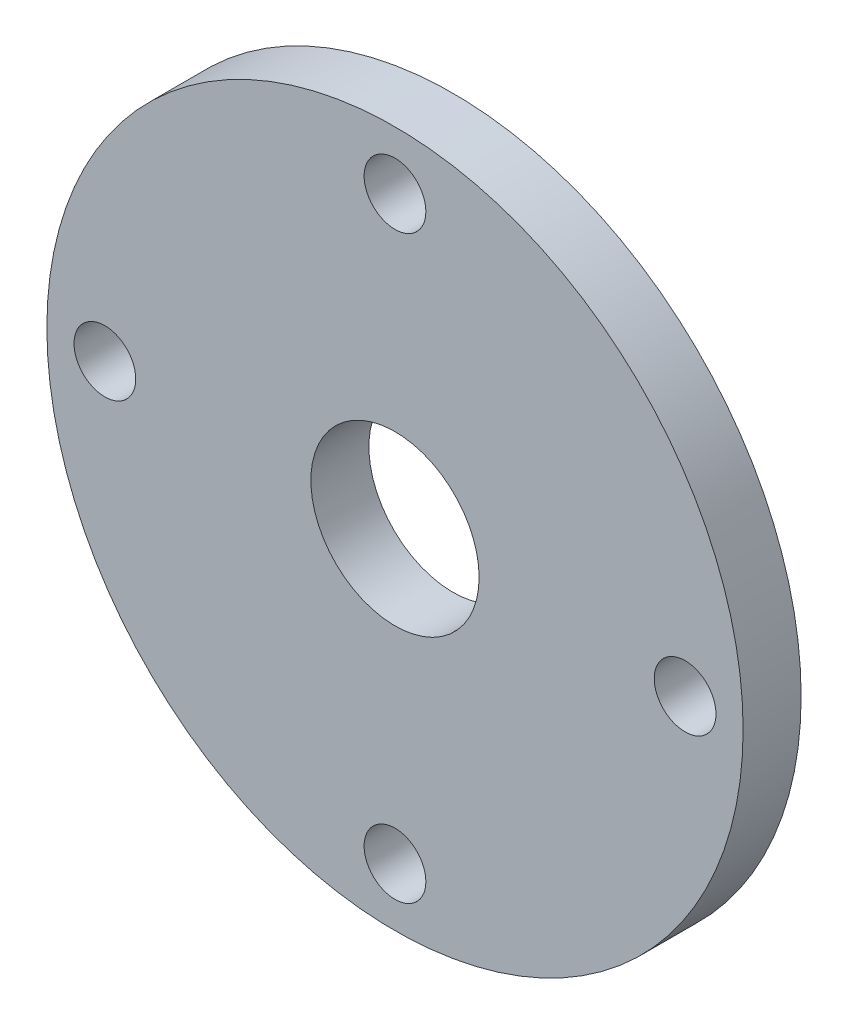
ISO-10303-21;
HEADER;
FILE_DESCRIPTION(('STEP AP214'),'2;1');
FILE_NAME('part.step','',(''),(''),'','','');
FILE_SCHEMA(('AUTOMOTIVE_DESIGN { 1 0 10303 214 1 1 1 1 }'));
ENDSEC;
DATA;
#1=APPLICATION_CONTEXT('core data for automotive mechanical design processes');
#2=APPLICATION_PROTOCOL_DEFINITION('international standard','automotive_design',2000,#1);
#3=PRODUCT_CONTEXT('',#1,'mechanical');
#4=PRODUCT('Part','Part','',(#3));
#5=PRODUCT_RELATED_PRODUCT_CATEGORY('part','',(#4));
#6=PRODUCT_DEFINITION_FORMATION('','',#4);
#7=PRODUCT_DEFINITION_CONTEXT('part definition',#1,'design');
#8=PRODUCT_DEFINITION('design','',#6,#7);
#9=PRODUCT_DEFINITION_SHAPE('','',#8);
#10=(LENGTH_UNIT() NAMED_UNIT(*) SI_UNIT(.MILLI.,.METRE.));
#11=(NAMED_UNIT(*) PLANE_ANGLE_UNIT() SI_UNIT($,.RADIAN.));
#12=(NAMED_UNIT(*) SI_UNIT($,.STERADIAN.) SOLID_ANGLE_UNIT());
#13=UNCERTAINTY_MEASURE_WITH_UNIT(LENGTH_MEASURE(1.E-05),#10,'distance_accuracy_value','');
#14=(GEOMETRIC_REPRESENTATION_CONTEXT(3) GLOBAL_UNCERTAINTY_ASSIGNED_CONTEXT((#13)) GLOBAL_UNIT_ASSIGNED_CONTEXT((#10,
#11,#12)) REPRESENTATION_CONTEXT('',''));
#15=CARTESIAN_POINT('',(0.,0.,0.));
#16=DIRECTION('',(0.,0.,1.));
#17=DIRECTION('',(1.,0.,0.));
#18=AXIS2_PLACEMENT_3D('',#15,#16,#17);
#19=CARTESIAN_POINT('',(0.,0.,6.35));
#20=DIRECTION('',(0.,0.,-1.));
#21=DIRECTION('',(-1.,0.,0.));
#22=AXIS2_PLACEMENT_3D('',#19,#20,#21);
#23=CYLINDRICAL_SURFACE('',#22,38.1);
#24=CARTESIAN_POINT('',(0.,0.,6.35));
#25=DIRECTION('',(0.,0.,1.));
#26=DIRECTION('',(1.,0.,0.));
#27=AXIS2_PLACEMENT_3D('',#24,#25,#26);
#28=CIRCLE('',#27,38.1);
#29=CARTESIAN_POINT('',(38.1,0.,6.35));
#30=VERTEX_POINT('',#29);
#31=EDGE_CURVE('E10',#30,#30,#28,.T.);
#32=ORIENTED_EDGE('',*,*,#31,.F.);
#33=EDGE_LOOP('',(#32));
#34=FACE_BOUND('',#33,.T.);
#35=CARTESIAN_POINT('',(0.,0.,0.));
#36=DIRECTION('',(0.,0.,1.));
#37=DIRECTION('',(1.,0.,0.));
#38=AXIS2_PLACEMENT_3D('',#35,#36,#37);
#39=CIRCLE('',#38,38.1);
#40=CARTESIAN_POINT('',(38.1,0.,0.));
#41=VERTEX_POINT('',#40);
#42=EDGE_CURVE('E34',#41,#41,#39,.T.);
#43=ORIENTED_EDGE('',*,*,#42,.T.);
#44=EDGE_LOOP('',(#43));
#45=FACE_BOUND('',#44,.T.);
#46=ADVANCED_FACE('F31',(#34,#45),#23,.T.);
#47=CARTESIAN_POINT('',(0.,0.,6.35));
#48=DIRECTION('',(0.,0.,1.));
#49=DIRECTION('',(1.,0.,0.));
#50=AXIS2_PLACEMENT_3D('',#47,#48,#49);
#51=PLANE('',#50);
#52=CARTESIAN_POINT('',(0.,0.,6.35));
#53=DIRECTION('',(0.,0.,1.));
#54=DIRECTION('',(1.,0.,0.));
#55=AXIS2_PLACEMENT_3D('',#52,#53,#54);
#56=CIRCLE('',#55,9.2075);
#57=CARTESIAN_POINT('',(9.2075,0.,6.35));
#58=VERTEX_POINT('',#57);
#59=EDGE_CURVE('E67',#58,#58,#56,.T.);
#60=ORIENTED_EDGE('',*,*,#59,.F.);
#61=EDGE_LOOP('',(#60));
#62=FACE_BOUND('',#61,.T.);
#63=CARTESIAN_POINT('',(0.,31.75,6.35));
#64=DIRECTION('',(0.,0.,1.));
#65=DIRECTION('',(1.,0.,0.));
#66=AXIS2_PLACEMENT_3D('',#63,#64,#65);
#67=CIRCLE('',#66,3.3782);
#68=CARTESIAN_POINT('',(3.3782,31.75,6.35));
#69=VERTEX_POINT('',#68);
#70=EDGE_CURVE('E62',#69,#69,#67,.T.);
#71=ORIENTED_EDGE('',*,*,#70,.F.);
#72=EDGE_LOOP('',(#71));
#73=FACE_BOUND('',#72,.T.);
#74=CARTESIAN_POINT('',(31.75,0.,6.35));
#75=DIRECTION('',(0.,0.,1.));
#76=DIRECTION('',(1.,0.,0.));
#77=AXIS2_PLACEMENT_3D('',#74,#75,#76);
#78=CIRCLE('',#77,3.3782);
#79=CARTESIAN_POINT('',(35.1282,0.,6.35));
#80=VERTEX_POINT('',#79);
#81=EDGE_CURVE('E56',#80,#80,#78,.T.);
#82=ORIENTED_EDGE('',*,*,#81,.F.);
#83=EDGE_LOOP('',(#82));
#84=FACE_BOUND('',#83,.T.);
#85=CARTESIAN_POINT('',(0.,-31.75,6.35));
#86=DIRECTION('',(0.,0.,1.));
#87=DIRECTION('',(1.,0.,0.));
#88=AXIS2_PLACEMENT_3D('',#85,#86,#87);
#89=CIRCLE('',#88,3.3782);
#90=CARTESIAN_POINT('',(3.3782,-31.75,6.35));
#91=VERTEX_POINT('',#90);
#92=EDGE_CURVE('E50',#91,#91,#89,.T.);
#93=ORIENTED_EDGE('',*,*,#92,.F.);
#94=EDGE_LOOP('',(#93));
#95=FACE_BOUND('',#94,.T.);
#96=CARTESIAN_POINT('',(-31.75,0.,6.35));
#97=DIRECTION('',(0.,0.,1.));
#98=DIRECTION('',(1.,0.,0.));
#99=AXIS2_PLACEMENT_3D('',#96,#97,#98);
#100=CIRCLE('',#99,3.3782);
#101=CARTESIAN_POINT('',(-28.3718,0.,6.35));
#102=VERTEX_POINT('',#101);
#103=EDGE_CURVE('E43',#102,#102,#100,.T.);
#104=ORIENTED_EDGE('',*,*,#103,.F.);
#105=EDGE_LOOP('',(#104));
#106=FACE_BOUND('',#105,.T.);
#107=ORIENTED_EDGE('',*,*,#31,.T.);
#108=EDGE_LOOP('',(#107));
#109=FACE_BOUND('',#108,.T.);
#110=ADVANCED_FACE('F83',(#62,#73,#84,#95,#106,#109),#51,.T.);
#111=CARTESIAN_POINT('',(0.,0.,0.));
#112=DIRECTION('',(0.,0.,1.));
#113=DIRECTION('',(1.,0.,0.));
#114=AXIS2_PLACEMENT_3D('',#111,#112,#113);
#115=PLANE('',#114);
#116=CARTESIAN_POINT('',(0.,0.,0.));
#117=DIRECTION('',(0.,0.,1.));
#118=DIRECTION('',(1.,0.,0.));
#119=AXIS2_PLACEMENT_3D('',#116,#117,#118);
#120=CIRCLE('',#119,9.2075);
#121=CARTESIAN_POINT('',(9.2075,0.,0.));
#122=VERTEX_POINT('',#121);
#123=EDGE_CURVE('E47',#122,#122,#120,.T.);
#124=ORIENTED_EDGE('',*,*,#123,.T.);
#125=EDGE_LOOP('',(#124));
#126=FACE_BOUND('',#125,.T.);
#127=CARTESIAN_POINT('',(0.,31.75,0.));
#128=DIRECTION('',(0.,0.,1.));
#129=DIRECTION('',(1.,0.,0.));
#130=AXIS2_PLACEMENT_3D('',#127,#128,#129);
#131=CIRCLE('',#130,3.3782);
#132=CARTESIAN_POINT('',(3.3782,31.75,0.));
#133=VERTEX_POINT('',#132);
#134=EDGE_CURVE('E41',#133,#133,#131,.T.);
#135=ORIENTED_EDGE('',*,*,#134,.T.);
#136=EDGE_LOOP('',(#135));
#137=FACE_BOUND('',#136,.T.);
#138=CARTESIAN_POINT('',(31.75,0.,0.));
#139=DIRECTION('',(0.,0.,1.));
#140=DIRECTION('',(1.,0.,0.));
#141=AXIS2_PLACEMENT_3D('',#138,#139,#140);
#142=CIRCLE('',#141,3.3782);
#143=CARTESIAN_POINT('',(35.1282,0.,0.));
#144=VERTEX_POINT('',#143);
#145=EDGE_CURVE('E59',#144,#144,#142,.T.);
#146=ORIENTED_EDGE('',*,*,#145,.T.);
#147=EDGE_LOOP('',(#146));
#148=FACE_BOUND('',#147,.T.);
#149=CARTESIAN_POINT('',(0.,-31.75,0.));
#150=DIRECTION('',(0.,0.,1.));
#151=DIRECTION('',(1.,0.,0.));
#152=AXIS2_PLACEMENT_3D('',#149,#150,#151);
#153=CIRCLE('',#152,3.3782);
#154=CARTESIAN_POINT('',(3.3782,-31.75,0.));
#155=VERTEX_POINT('',#154);
#156=EDGE_CURVE('E53',#155,#155,#153,.T.);
#157=ORIENTED_EDGE('',*,*,#156,.T.);
#158=EDGE_LOOP('',(#157));
#159=FACE_BOUND('',#158,.T.);
#160=CARTESIAN_POINT('',(-31.75,0.,0.));
#161=DIRECTION('',(0.,0.,1.));
#162=DIRECTION('',(1.,0.,0.));
#163=AXIS2_PLACEMENT_3D('',#160,#161,#162);
#164=CIRCLE('',#163,3.3782);
#165=CARTESIAN_POINT('',(-28.3718,0.,0.));
#166=VERTEX_POINT('',#165);
#167=EDGE_CURVE('E46',#166,#166,#164,.T.);
#168=ORIENTED_EDGE('',*,*,#167,.T.);
#169=EDGE_LOOP('',(#168));
#170=FACE_BOUND('',#169,.T.);
#171=ORIENTED_EDGE('',*,*,#42,.F.);
#172=EDGE_LOOP('',(#171));
#173=FACE_BOUND('',#172,.T.);
#174=ADVANCED_FACE('F73',(#126,#137,#148,#159,#170,#173),#115,.F.);
#175=CARTESIAN_POINT('',(-31.75,0.,0.));
#176=DIRECTION('',(0.,0.,1.));
#177=DIRECTION('',(1.,0.,0.));
#178=AXIS2_PLACEMENT_3D('',#175,#176,#177);
#179=CYLINDRICAL_SURFACE('',#178,3.3782);
#180=ORIENTED_EDGE('',*,*,#167,.F.);
#181=EDGE_LOOP('',(#180));
#182=FACE_BOUND('',#181,.T.);
#183=ORIENTED_EDGE('',*,*,#103,.T.);
#184=EDGE_LOOP('',(#183));
#185=FACE_BOUND('',#184,.T.);
#186=ADVANCED_FACE('F95',(#182,#185),#179,.F.);
#187=CARTESIAN_POINT('',(0.,-31.75,0.));
#188=DIRECTION('',(0.,0.,1.));
#189=DIRECTION('',(1.,0.,0.));
#190=AXIS2_PLACEMENT_3D('',#187,#188,#189);
#191=CYLINDRICAL_SURFACE('',#190,3.3782);
#192=ORIENTED_EDGE('',*,*,#156,.F.);
#193=EDGE_LOOP('',(#192));
#194=FACE_BOUND('',#193,.T.);
#195=ORIENTED_EDGE('',*,*,#92,.T.);
#196=EDGE_LOOP('',(#195));
#197=FACE_BOUND('',#196,.T.);
#198=ADVANCED_FACE('F97',(#194,#197),#191,.F.);
#199=CARTESIAN_POINT('',(31.75,0.,0.));
#200=DIRECTION('',(0.,0.,1.));
#201=DIRECTION('',(1.,0.,0.));
#202=AXIS2_PLACEMENT_3D('',#199,#200,#201);
#203=CYLINDRICAL_SURFACE('',#202,3.3782);
#204=ORIENTED_EDGE('',*,*,#145,.F.);
#205=EDGE_LOOP('',(#204));
#206=FACE_BOUND('',#205,.T.);
#207=ORIENTED_EDGE('',*,*,#81,.T.);
#208=EDGE_LOOP('',(#207));
#209=FACE_BOUND('',#208,.T.);
#210=ADVANCED_FACE('F104',(#206,#209),#203,.F.);
#211=CARTESIAN_POINT('',(0.,31.75,0.));
#212=DIRECTION('',(0.,0.,1.));
#213=DIRECTION('',(1.,0.,0.));
#214=AXIS2_PLACEMENT_3D('',#211,#212,#213);
#215=CYLINDRICAL_SURFACE('',#214,3.3782);
#216=ORIENTED_EDGE('',*,*,#134,.F.);
#217=EDGE_LOOP('',(#216));
#218=FACE_BOUND('',#217,.T.);
#219=ORIENTED_EDGE('',*,*,#70,.T.);
#220=EDGE_LOOP('',(#219));
#221=FACE_BOUND('',#220,.T.);
#222=ADVANCED_FACE('F79',(#218,#221),#215,.F.);
#223=CARTESIAN_POINT('',(0.,0.,0.));
#224=DIRECTION('',(0.,0.,1.));
#225=DIRECTION('',(1.,0.,0.));
#226=AXIS2_PLACEMENT_3D('',#223,#224,#225);
#227=CYLINDRICAL_SURFACE('',#226,9.2075);
#228=ORIENTED_EDGE('',*,*,#123,.F.);
#229=EDGE_LOOP('',(#228));
#230=FACE_BOUND('',#229,.T.);
#231=ORIENTED_EDGE('',*,*,#59,.T.);
#232=EDGE_LOOP('',(#231));
#233=FACE_BOUND('',#232,.T.);
#234=ADVANCED_FACE('F76',(#230,#233),#227,.F.);
#235=CLOSED_SHELL('',(#46,#110,#174,#186,#198,#210,#222,#234));
#236=MANIFOLD_SOLID_BREP('B2',#235);
#237=ADVANCED_BREP_SHAPE_REPRESENTATION('',(#18,#236),#14);
#238=SHAPE_DEFINITION_REPRESENTATION(#9,#237);
ENDSEC;
END-ISO-10303-21;
